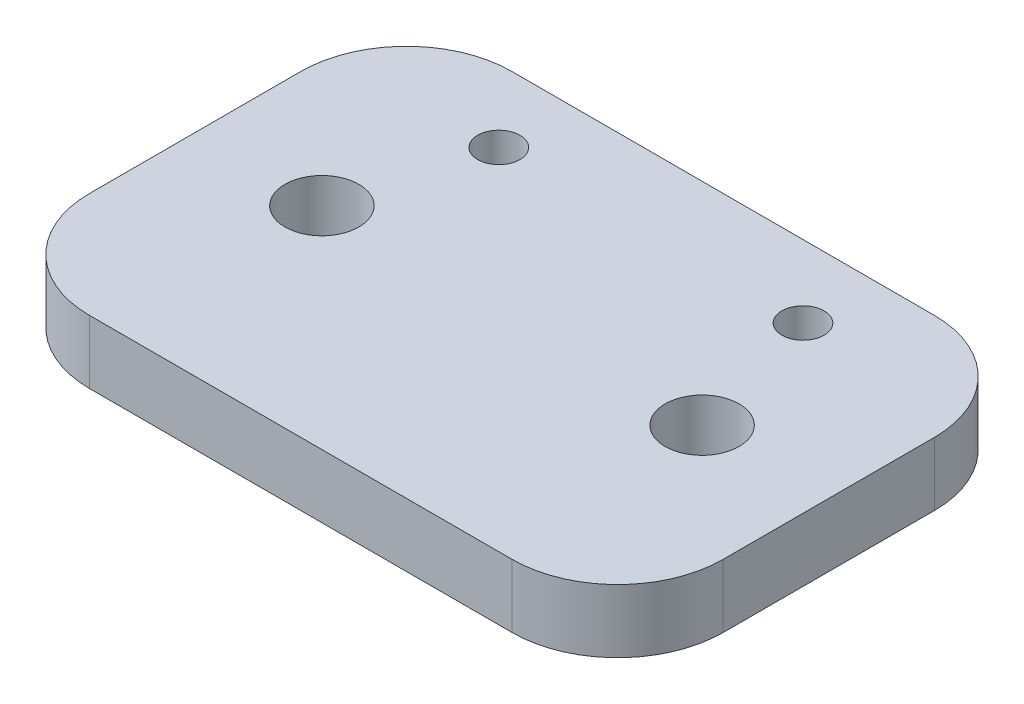
ISO-10303-21;
HEADER;
FILE_DESCRIPTION(('STEP AP214'),'2;1');
FILE_NAME('part.step','',(''),(''),'','','');
FILE_SCHEMA(('AUTOMOTIVE_DESIGN { 1 0 10303 214 1 1 1 1 }'));
ENDSEC;
DATA;
#1=APPLICATION_CONTEXT('core data for automotive mechanical design processes');
#2=APPLICATION_PROTOCOL_DEFINITION('international standard','automotive_design',2000,#1);
#3=PRODUCT_CONTEXT('',#1,'mechanical');
#4=PRODUCT('Part','Part','',(#3));
#5=PRODUCT_RELATED_PRODUCT_CATEGORY('part','',(#4));
#6=PRODUCT_DEFINITION_FORMATION('','',#4);
#7=PRODUCT_DEFINITION_CONTEXT('part definition',#1,'design');
#8=PRODUCT_DEFINITION('design','',#6,#7);
#9=PRODUCT_DEFINITION_SHAPE('','',#8);
#10=(LENGTH_UNIT() NAMED_UNIT(*) SI_UNIT(.MILLI.,.METRE.));
#11=(NAMED_UNIT(*) PLANE_ANGLE_UNIT() SI_UNIT($,.RADIAN.));
#12=(NAMED_UNIT(*) SI_UNIT($,.STERADIAN.) SOLID_ANGLE_UNIT());
#13=UNCERTAINTY_MEASURE_WITH_UNIT(LENGTH_MEASURE(1.E-05),#10,'distance_accuracy_value','');
#14=(GEOMETRIC_REPRESENTATION_CONTEXT(3) GLOBAL_UNCERTAINTY_ASSIGNED_CONTEXT((#13)) GLOBAL_UNIT_ASSIGNED_CONTEXT((#10,
#11,#12)) REPRESENTATION_CONTEXT('',''));
#15=CARTESIAN_POINT('',(0.,0.,0.));
#16=DIRECTION('',(0.,0.,1.));
#17=DIRECTION('',(1.,0.,0.));
#18=AXIS2_PLACEMENT_3D('',#15,#16,#17);
#19=CARTESIAN_POINT('',(10.,3.,5.));
#20=DIRECTION('',(0.,1.,0.));
#21=DIRECTION('',(0.,0.,1.));
#22=AXIS2_PLACEMENT_3D('',#19,#20,#21);
#23=PLANE('',#22);
#24=CARTESIAN_POINT('',(7.2,3.,-6.57499999999999));
#25=DIRECTION('',(0.,1.,0.));
#26=DIRECTION('',(0.,0.,1.));
#27=AXIS2_PLACEMENT_3D('',#24,#25,#26);
#28=CIRCLE('',#27,1.);
#29=CARTESIAN_POINT('',(7.2,3.,-5.57499999999999));
#30=VERTEX_POINT('',#29);
#31=EDGE_CURVE('E225',#30,#30,#28,.T.);
#32=ORIENTED_EDGE('',*,*,#31,.F.);
#33=EDGE_LOOP('',(#32));
#34=FACE_BOUND('',#33,.T.);
#35=CARTESIAN_POINT('',(-9.,3.,0.));
#36=DIRECTION('',(0.,1.,0.));
#37=DIRECTION('',(0.,0.,1.));
#38=AXIS2_PLACEMENT_3D('',#35,#36,#37);
#39=CIRCLE('',#38,1.75);
#40=CARTESIAN_POINT('',(-9.,3.,1.75));
#41=VERTEX_POINT('',#40);
#42=EDGE_CURVE('E150',#41,#41,#39,.T.);
#43=ORIENTED_EDGE('',*,*,#42,.F.);
#44=EDGE_LOOP('',(#43));
#45=FACE_BOUND('',#44,.T.);
#46=CARTESIAN_POINT('',(10.,3.,5.));
#47=DIRECTION('',(0.,1.,0.));
#48=DIRECTION('',(0.,0.,1.));
#49=AXIS2_PLACEMENT_3D('',#46,#47,#48);
#50=CIRCLE('',#49,5.);
#51=CARTESIAN_POINT('',(9.99999999999997,3.,10.));
#52=VERTEX_POINT('',#51);
#53=CARTESIAN_POINT('',(15.,3.,4.99999999999997));
#54=VERTEX_POINT('',#53);
#55=EDGE_CURVE('E168',#52,#54,#50,.T.);
#56=ORIENTED_EDGE('',*,*,#55,.T.);
#57=DIRECTION('',(0.,0.,-1.));
#58=VECTOR('',#57,1.);
#59=CARTESIAN_POINT('',(15.,3.,4.99999999999997));
#60=LINE('',#59,#58);
#61=CARTESIAN_POINT('',(15.,3.,-4.99999999999996));
#62=VERTEX_POINT('',#61);
#63=EDGE_CURVE('E104',#54,#62,#60,.T.);
#64=ORIENTED_EDGE('',*,*,#63,.T.);
#65=CARTESIAN_POINT('',(10.,3.,-5.));
#66=DIRECTION('',(0.,1.,0.));
#67=DIRECTION('',(0.,0.,-1.));
#68=AXIS2_PLACEMENT_3D('',#65,#66,#67);
#69=CIRCLE('',#68,5.);
#70=CARTESIAN_POINT('',(9.99999999999997,3.,-10.));
#71=VERTEX_POINT('',#70);
#72=EDGE_CURVE('E189',#62,#71,#69,.T.);
#73=ORIENTED_EDGE('',*,*,#72,.T.);
#74=DIRECTION('',(-1.,0.,0.));
#75=VECTOR('',#74,1.);
#76=CARTESIAN_POINT('',(-9.99999999999996,3.,-10.));
#77=LINE('',#76,#75);
#78=CARTESIAN_POINT('',(-10.,3.,-10.));
#79=VERTEX_POINT('',#78);
#80=EDGE_CURVE('E203',#71,#79,#77,.T.);
#81=ORIENTED_EDGE('',*,*,#80,.T.);
#82=CARTESIAN_POINT('',(-10.,3.,-5.));
#83=DIRECTION('',(0.,1.,0.));
#84=DIRECTION('',(0.,0.,-1.));
#85=AXIS2_PLACEMENT_3D('',#82,#83,#84);
#86=CIRCLE('',#85,5.);
#87=CARTESIAN_POINT('',(-15.,3.,-4.99999999999996));
#88=VERTEX_POINT('',#87);
#89=EDGE_CURVE('E123',#79,#88,#86,.T.);
#90=ORIENTED_EDGE('',*,*,#89,.T.);
#91=DIRECTION('',(0.,0.,1.));
#92=VECTOR('',#91,1.);
#93=CARTESIAN_POINT('',(-15.,3.,4.99999999999997));
#94=LINE('',#93,#92);
#95=CARTESIAN_POINT('',(-15.,3.,4.99999999999997));
#96=VERTEX_POINT('',#95);
#97=EDGE_CURVE('E117',#88,#96,#94,.T.);
#98=ORIENTED_EDGE('',*,*,#97,.T.);
#99=CARTESIAN_POINT('',(-10.,3.,5.));
#100=DIRECTION('',(0.,1.,0.));
#101=DIRECTION('',(0.,0.,-1.));
#102=AXIS2_PLACEMENT_3D('',#99,#100,#101);
#103=CIRCLE('',#102,5.);
#104=CARTESIAN_POINT('',(-9.99999999999996,3.,10.));
#105=VERTEX_POINT('',#104);
#106=EDGE_CURVE('E121',#96,#105,#103,.T.);
#107=ORIENTED_EDGE('',*,*,#106,.T.);
#108=DIRECTION('',(1.,0.,0.));
#109=VECTOR('',#108,1.);
#110=CARTESIAN_POINT('',(-9.99999999999996,3.,10.));
#111=LINE('',#110,#109);
#112=EDGE_CURVE('E61',#105,#52,#111,.T.);
#113=ORIENTED_EDGE('',*,*,#112,.T.);
#114=EDGE_LOOP('',(#56,#64,#73,#81,#90,#98,#107,#113));
#115=FACE_BOUND('',#114,.T.);
#116=CARTESIAN_POINT('',(9.,3.,0.));
#117=DIRECTION('',(0.,1.,0.));
#118=DIRECTION('',(0.,0.,1.));
#119=AXIS2_PLACEMENT_3D('',#116,#117,#118);
#120=CIRCLE('',#119,1.75);
#121=CARTESIAN_POINT('',(9.,3.,1.75));
#122=VERTEX_POINT('',#121);
#123=EDGE_CURVE('E217',#122,#122,#120,.T.);
#124=ORIENTED_EDGE('',*,*,#123,.F.);
#125=EDGE_LOOP('',(#124));
#126=FACE_BOUND('',#125,.T.);
#127=CARTESIAN_POINT('',(-7.2,3.,-6.57499999999999));
#128=DIRECTION('',(0.,1.,0.));
#129=DIRECTION('',(0.,0.,1.));
#130=AXIS2_PLACEMENT_3D('',#127,#128,#129);
#131=CIRCLE('',#130,1.);
#132=CARTESIAN_POINT('',(-7.2,3.,-5.57499999999999));
#133=VERTEX_POINT('',#132);
#134=EDGE_CURVE('E233',#133,#133,#131,.T.);
#135=ORIENTED_EDGE('',*,*,#134,.F.);
#136=EDGE_LOOP('',(#135));
#137=FACE_BOUND('',#136,.T.);
#138=ADVANCED_FACE('F43',(#34,#45,#115,#126,#137),#23,.T.);
#139=CARTESIAN_POINT('',(10.,0.,5.));
#140=DIRECTION('',(0.,1.,0.));
#141=DIRECTION('',(0.,0.,1.));
#142=AXIS2_PLACEMENT_3D('',#139,#140,#141);
#143=PLANE('',#142);
#144=CARTESIAN_POINT('',(10.,0.,5.));
#145=DIRECTION('',(0.,1.,0.));
#146=DIRECTION('',(0.,0.,1.));
#147=AXIS2_PLACEMENT_3D('',#144,#145,#146);
#148=CIRCLE('',#147,5.);
#149=CARTESIAN_POINT('',(9.99999999999997,0.,10.));
#150=VERTEX_POINT('',#149);
#151=CARTESIAN_POINT('',(15.,0.,4.99999999999997));
#152=VERTEX_POINT('',#151);
#153=EDGE_CURVE('E145',#150,#152,#148,.T.);
#154=ORIENTED_EDGE('',*,*,#153,.F.);
#155=DIRECTION('',(1.,0.,0.));
#156=VECTOR('',#155,1.);
#157=CARTESIAN_POINT('',(-9.99999999999996,0.,10.));
#158=LINE('',#157,#156);
#159=CARTESIAN_POINT('',(-9.99999999999996,0.,10.));
#160=VERTEX_POINT('',#159);
#161=EDGE_CURVE('E96',#160,#150,#158,.T.);
#162=ORIENTED_EDGE('',*,*,#161,.F.);
#163=CARTESIAN_POINT('',(-10.,0.,5.));
#164=DIRECTION('',(0.,1.,0.));
#165=DIRECTION('',(0.,0.,-1.));
#166=AXIS2_PLACEMENT_3D('',#163,#164,#165);
#167=CIRCLE('',#166,5.);
#168=CARTESIAN_POINT('',(-15.,0.,4.99999999999997));
#169=VERTEX_POINT('',#168);
#170=EDGE_CURVE('E90',#169,#160,#167,.T.);
#171=ORIENTED_EDGE('',*,*,#170,.F.);
#172=DIRECTION('',(0.,0.,1.));
#173=VECTOR('',#172,1.);
#174=CARTESIAN_POINT('',(-15.,0.,4.99999999999997));
#175=LINE('',#174,#173);
#176=CARTESIAN_POINT('',(-15.,0.,-4.99999999999996));
#177=VERTEX_POINT('',#176);
#178=EDGE_CURVE('E132',#177,#169,#175,.T.);
#179=ORIENTED_EDGE('',*,*,#178,.F.);
#180=CARTESIAN_POINT('',(-10.,0.,-5.));
#181=DIRECTION('',(0.,1.,0.));
#182=DIRECTION('',(0.,0.,-1.));
#183=AXIS2_PLACEMENT_3D('',#180,#181,#182);
#184=CIRCLE('',#183,5.);
#185=CARTESIAN_POINT('',(-10.,0.,-10.));
#186=VERTEX_POINT('',#185);
#187=EDGE_CURVE('E159',#186,#177,#184,.T.);
#188=ORIENTED_EDGE('',*,*,#187,.F.);
#189=DIRECTION('',(-1.,0.,0.));
#190=VECTOR('',#189,1.);
#191=CARTESIAN_POINT('',(-9.99999999999996,0.,-10.));
#192=LINE('',#191,#190);
#193=CARTESIAN_POINT('',(9.99999999999997,0.,-10.));
#194=VERTEX_POINT('',#193);
#195=EDGE_CURVE('E156',#194,#186,#192,.T.);
#196=ORIENTED_EDGE('',*,*,#195,.F.);
#197=CARTESIAN_POINT('',(10.,0.,-5.));
#198=DIRECTION('',(0.,1.,0.));
#199=DIRECTION('',(0.,0.,-1.));
#200=AXIS2_PLACEMENT_3D('',#197,#198,#199);
#201=CIRCLE('',#200,5.);
#202=CARTESIAN_POINT('',(15.,0.,-4.99999999999996));
#203=VERTEX_POINT('',#202);
#204=EDGE_CURVE('E153',#203,#194,#201,.T.);
#205=ORIENTED_EDGE('',*,*,#204,.F.);
#206=DIRECTION('',(0.,0.,-1.));
#207=VECTOR('',#206,1.);
#208=CARTESIAN_POINT('',(15.,0.,4.99999999999997));
#209=LINE('',#208,#207);
#210=EDGE_CURVE('E149',#152,#203,#209,.T.);
#211=ORIENTED_EDGE('',*,*,#210,.F.);
#212=EDGE_LOOP('',(#154,#162,#171,#179,#188,#196,#205,#211));
#213=FACE_BOUND('',#212,.T.);
#214=CARTESIAN_POINT('',(-9.,0.,0.));
#215=DIRECTION('',(0.,1.,0.));
#216=DIRECTION('',(0.,0.,1.));
#217=AXIS2_PLACEMENT_3D('',#214,#215,#216);
#218=CIRCLE('',#217,1.75);
#219=CARTESIAN_POINT('',(-9.,0.,1.75));
#220=VERTEX_POINT('',#219);
#221=EDGE_CURVE('E213',#220,#220,#218,.T.);
#222=ORIENTED_EDGE('',*,*,#221,.T.);
#223=EDGE_LOOP('',(#222));
#224=FACE_BOUND('',#223,.T.);
#225=CARTESIAN_POINT('',(9.,0.,0.));
#226=DIRECTION('',(0.,1.,0.));
#227=DIRECTION('',(0.,0.,1.));
#228=AXIS2_PLACEMENT_3D('',#225,#226,#227);
#229=CIRCLE('',#228,1.75);
#230=CARTESIAN_POINT('',(9.,0.,1.75));
#231=VERTEX_POINT('',#230);
#232=EDGE_CURVE('E221',#231,#231,#229,.T.);
#233=ORIENTED_EDGE('',*,*,#232,.T.);
#234=EDGE_LOOP('',(#233));
#235=FACE_BOUND('',#234,.T.);
#236=CARTESIAN_POINT('',(7.2,0.,-6.57499999999999));
#237=DIRECTION('',(0.,1.,0.));
#238=DIRECTION('',(0.,0.,1.));
#239=AXIS2_PLACEMENT_3D('',#236,#237,#238);
#240=CIRCLE('',#239,1.);
#241=CARTESIAN_POINT('',(7.2,0.,-5.57499999999999));
#242=VERTEX_POINT('',#241);
#243=EDGE_CURVE('E229',#242,#242,#240,.T.);
#244=ORIENTED_EDGE('',*,*,#243,.T.);
#245=EDGE_LOOP('',(#244));
#246=FACE_BOUND('',#245,.T.);
#247=CARTESIAN_POINT('',(-7.2,0.,-6.57499999999999));
#248=DIRECTION('',(0.,1.,0.));
#249=DIRECTION('',(0.,0.,1.));
#250=AXIS2_PLACEMENT_3D('',#247,#248,#249);
#251=CIRCLE('',#250,1.);
#252=CARTESIAN_POINT('',(-7.2,0.,-5.57499999999999));
#253=VERTEX_POINT('',#252);
#254=EDGE_CURVE('E237',#253,#253,#251,.T.);
#255=ORIENTED_EDGE('',*,*,#254,.T.);
#256=EDGE_LOOP('',(#255));
#257=FACE_BOUND('',#256,.T.);
#258=ADVANCED_FACE('F193',(#213,#224,#235,#246,#257),#143,.F.);
#259=CARTESIAN_POINT('',(10.,3.,5.));
#260=DIRECTION('',(0.,-1.,0.));
#261=DIRECTION('',(0.,0.,-1.));
#262=AXIS2_PLACEMENT_3D('',#259,#260,#261);
#263=CYLINDRICAL_SURFACE('',#262,5.);
#264=ORIENTED_EDGE('',*,*,#153,.T.);
#265=DIRECTION('',(0.,-1.,0.));
#266=VECTOR('',#265,1.);
#267=CARTESIAN_POINT('',(15.,3.,4.99999999999997));
#268=LINE('',#267,#266);
#269=EDGE_CURVE('E11',#54,#152,#268,.T.);
#270=ORIENTED_EDGE('',*,*,#269,.F.);
#271=ORIENTED_EDGE('',*,*,#55,.F.);
#272=DIRECTION('',(0.,-1.,0.));
#273=VECTOR('',#272,1.);
#274=CARTESIAN_POINT('',(9.99999999999997,3.,10.));
#275=LINE('',#274,#273);
#276=EDGE_CURVE('E141',#52,#150,#275,.T.);
#277=ORIENTED_EDGE('',*,*,#276,.T.);
#278=EDGE_LOOP('',(#264,#270,#271,#277));
#279=FACE_BOUND('',#278,.T.);
#280=ADVANCED_FACE('F45',(#279),#263,.T.);
#281=CARTESIAN_POINT('',(15.,3.,4.99999999999997));
#282=DIRECTION('',(-1.,0.,0.));
#283=DIRECTION('',(0.,0.,1.));
#284=AXIS2_PLACEMENT_3D('',#281,#282,#283);
#285=PLANE('',#284);
#286=ORIENTED_EDGE('',*,*,#210,.T.);
#287=DIRECTION('',(0.,-1.,0.));
#288=VECTOR('',#287,1.);
#289=CARTESIAN_POINT('',(15.,3.,-4.99999999999996));
#290=LINE('',#289,#288);
#291=EDGE_CURVE('E53',#62,#203,#290,.T.);
#292=ORIENTED_EDGE('',*,*,#291,.F.);
#293=ORIENTED_EDGE('',*,*,#63,.F.);
#294=ORIENTED_EDGE('',*,*,#269,.T.);
#295=EDGE_LOOP('',(#286,#292,#293,#294));
#296=FACE_BOUND('',#295,.T.);
#297=ADVANCED_FACE('F273',(#296),#285,.F.);
#298=CARTESIAN_POINT('',(10.,3.,-5.));
#299=DIRECTION('',(0.,-1.,0.));
#300=DIRECTION('',(0.,0.,-1.));
#301=AXIS2_PLACEMENT_3D('',#298,#299,#300);
#302=CYLINDRICAL_SURFACE('',#301,5.);
#303=ORIENTED_EDGE('',*,*,#204,.T.);
#304=DIRECTION('',(0.,-1.,0.));
#305=VECTOR('',#304,1.);
#306=CARTESIAN_POINT('',(9.99999999999997,3.,-10.));
#307=LINE('',#306,#305);
#308=EDGE_CURVE('E179',#71,#194,#307,.T.);
#309=ORIENTED_EDGE('',*,*,#308,.F.);
#310=ORIENTED_EDGE('',*,*,#72,.F.);
#311=ORIENTED_EDGE('',*,*,#291,.T.);
#312=EDGE_LOOP('',(#303,#309,#310,#311));
#313=FACE_BOUND('',#312,.T.);
#314=ADVANCED_FACE('F187',(#313),#302,.T.);
#315=CARTESIAN_POINT('',(-9.99999999999996,3.,-10.));
#316=DIRECTION('',(0.,0.,1.));
#317=DIRECTION('',(1.,0.,0.));
#318=AXIS2_PLACEMENT_3D('',#315,#316,#317);
#319=PLANE('',#318);
#320=ORIENTED_EDGE('',*,*,#195,.T.);
#321=DIRECTION('',(0.,-1.,0.));
#322=VECTOR('',#321,1.);
#323=CARTESIAN_POINT('',(-10.,3.,-10.));
#324=LINE('',#323,#322);
#325=EDGE_CURVE('E175',#79,#186,#324,.T.);
#326=ORIENTED_EDGE('',*,*,#325,.F.);
#327=ORIENTED_EDGE('',*,*,#80,.F.);
#328=ORIENTED_EDGE('',*,*,#308,.T.);
#329=EDGE_LOOP('',(#320,#326,#327,#328));
#330=FACE_BOUND('',#329,.T.);
#331=ADVANCED_FACE('F198',(#330),#319,.F.);
#332=CARTESIAN_POINT('',(-10.,3.,-5.));
#333=DIRECTION('',(0.,-1.,0.));
#334=DIRECTION('',(0.,0.,-1.));
#335=AXIS2_PLACEMENT_3D('',#332,#333,#334);
#336=CYLINDRICAL_SURFACE('',#335,5.);
#337=ORIENTED_EDGE('',*,*,#187,.T.);
#338=DIRECTION('',(0.,-1.,0.));
#339=VECTOR('',#338,1.);
#340=CARTESIAN_POINT('',(-15.,3.,-4.99999999999996));
#341=LINE('',#340,#339);
#342=EDGE_CURVE('E134',#88,#177,#341,.T.);
#343=ORIENTED_EDGE('',*,*,#342,.F.);
#344=ORIENTED_EDGE('',*,*,#89,.F.);
#345=ORIENTED_EDGE('',*,*,#325,.T.);
#346=EDGE_LOOP('',(#337,#343,#344,#345));
#347=FACE_BOUND('',#346,.T.);
#348=ADVANCED_FACE('F201',(#347),#336,.T.);
#349=CARTESIAN_POINT('',(-15.,3.,4.99999999999997));
#350=DIRECTION('',(1.,0.,0.));
#351=DIRECTION('',(0.,0.,-1.));
#352=AXIS2_PLACEMENT_3D('',#349,#350,#351);
#353=PLANE('',#352);
#354=ORIENTED_EDGE('',*,*,#178,.T.);
#355=DIRECTION('',(0.,-1.,0.));
#356=VECTOR('',#355,1.);
#357=CARTESIAN_POINT('',(-15.,3.,4.99999999999997));
#358=LINE('',#357,#356);
#359=EDGE_CURVE('E129',#96,#169,#358,.T.);
#360=ORIENTED_EDGE('',*,*,#359,.F.);
#361=ORIENTED_EDGE('',*,*,#97,.F.);
#362=ORIENTED_EDGE('',*,*,#342,.T.);
#363=EDGE_LOOP('',(#354,#360,#361,#362));
#364=FACE_BOUND('',#363,.T.);
#365=ADVANCED_FACE('F130',(#364),#353,.F.);
#366=CARTESIAN_POINT('',(-10.,3.,5.));
#367=DIRECTION('',(0.,-1.,0.));
#368=DIRECTION('',(0.,0.,-1.));
#369=AXIS2_PLACEMENT_3D('',#366,#367,#368);
#370=CYLINDRICAL_SURFACE('',#369,5.);
#371=ORIENTED_EDGE('',*,*,#170,.T.);
#372=DIRECTION('',(0.,-1.,0.));
#373=VECTOR('',#372,1.);
#374=CARTESIAN_POINT('',(-9.99999999999996,3.,10.));
#375=LINE('',#374,#373);
#376=EDGE_CURVE('E135',#105,#160,#375,.T.);
#377=ORIENTED_EDGE('',*,*,#376,.F.);
#378=ORIENTED_EDGE('',*,*,#106,.F.);
#379=ORIENTED_EDGE('',*,*,#359,.T.);
#380=EDGE_LOOP('',(#371,#377,#378,#379));
#381=FACE_BOUND('',#380,.T.);
#382=ADVANCED_FACE('F137',(#381),#370,.T.);
#383=CARTESIAN_POINT('',(-9.99999999999996,3.,10.));
#384=DIRECTION('',(0.,0.,-1.));
#385=DIRECTION('',(-1.,0.,0.));
#386=AXIS2_PLACEMENT_3D('',#383,#384,#385);
#387=PLANE('',#386);
#388=ORIENTED_EDGE('',*,*,#161,.T.);
#389=ORIENTED_EDGE('',*,*,#276,.F.);
#390=ORIENTED_EDGE('',*,*,#112,.F.);
#391=ORIENTED_EDGE('',*,*,#376,.T.);
#392=EDGE_LOOP('',(#388,#389,#390,#391));
#393=FACE_BOUND('',#392,.T.);
#394=ADVANCED_FACE('F261',(#393),#387,.F.);
#395=CARTESIAN_POINT('',(-9.,3.,0.));
#396=DIRECTION('',(0.,-1.,0.));
#397=DIRECTION('',(0.,0.,-1.));
#398=AXIS2_PLACEMENT_3D('',#395,#396,#397);
#399=CYLINDRICAL_SURFACE('',#398,1.75);
#400=ORIENTED_EDGE('',*,*,#42,.T.);
#401=EDGE_LOOP('',(#400));
#402=FACE_BOUND('',#401,.T.);
#403=ORIENTED_EDGE('',*,*,#221,.F.);
#404=EDGE_LOOP('',(#403));
#405=FACE_BOUND('',#404,.T.);
#406=ADVANCED_FACE('F258',(#402,#405),#399,.F.);
#407=CARTESIAN_POINT('',(9.,3.,0.));
#408=DIRECTION('',(0.,-1.,0.));
#409=DIRECTION('',(0.,0.,-1.));
#410=AXIS2_PLACEMENT_3D('',#407,#408,#409);
#411=CYLINDRICAL_SURFACE('',#410,1.75);
#412=ORIENTED_EDGE('',*,*,#123,.T.);
#413=EDGE_LOOP('',(#412));
#414=FACE_BOUND('',#413,.T.);
#415=ORIENTED_EDGE('',*,*,#232,.F.);
#416=EDGE_LOOP('',(#415));
#417=FACE_BOUND('',#416,.T.);
#418=ADVANCED_FACE('F349',(#414,#417),#411,.F.);
#419=CARTESIAN_POINT('',(7.2,3.,-6.57499999999999));
#420=DIRECTION('',(0.,-1.,0.));
#421=DIRECTION('',(0.,0.,-1.));
#422=AXIS2_PLACEMENT_3D('',#419,#420,#421);
#423=CYLINDRICAL_SURFACE('',#422,1.);
#424=ORIENTED_EDGE('',*,*,#31,.T.);
#425=EDGE_LOOP('',(#424));
#426=FACE_BOUND('',#425,.T.);
#427=ORIENTED_EDGE('',*,*,#243,.F.);
#428=EDGE_LOOP('',(#427));
#429=FACE_BOUND('',#428,.T.);
#430=ADVANCED_FACE('F358',(#426,#429),#423,.F.);
#431=CARTESIAN_POINT('',(-7.2,3.,-6.57499999999999));
#432=DIRECTION('',(0.,-1.,0.));
#433=DIRECTION('',(0.,0.,-1.));
#434=AXIS2_PLACEMENT_3D('',#431,#432,#433);
#435=CYLINDRICAL_SURFACE('',#434,1.);
#436=ORIENTED_EDGE('',*,*,#134,.T.);
#437=EDGE_LOOP('',(#436));
#438=FACE_BOUND('',#437,.T.);
#439=ORIENTED_EDGE('',*,*,#254,.F.);
#440=EDGE_LOOP('',(#439));
#441=FACE_BOUND('',#440,.T.);
#442=ADVANCED_FACE('F245',(#438,#441),#435,.F.);
#443=CLOSED_SHELL('',(#138,#258,#280,#297,#314,#331,#348,#365,#382,#394,#406,#418,#430,#442));
#444=MANIFOLD_SOLID_BREP('B2',#443);
#445=ADVANCED_BREP_SHAPE_REPRESENTATION('',(#18,#444),#14);
#446=SHAPE_DEFINITION_REPRESENTATION(#9,#445);
ENDSEC;
END-ISO-10303-21;
